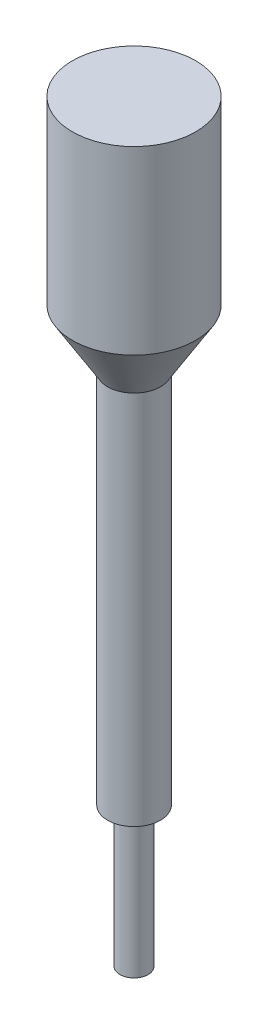
ISO-10303-21;
HEADER;
FILE_DESCRIPTION(('STEP AP214'),'2;1');
FILE_NAME('part.step','',(''),(''),'','','');
FILE_SCHEMA(('AUTOMOTIVE_DESIGN { 1 0 10303 214 1 1 1 1 }'));
ENDSEC;
DATA;
#1=APPLICATION_CONTEXT('core data for automotive mechanical design processes');
#2=APPLICATION_PROTOCOL_DEFINITION('international standard','automotive_design',2000,#1);
#3=PRODUCT_CONTEXT('',#1,'mechanical');
#4=PRODUCT('Part','Part','',(#3));
#5=PRODUCT_RELATED_PRODUCT_CATEGORY('part','',(#4));
#6=PRODUCT_DEFINITION_FORMATION('','',#4);
#7=PRODUCT_DEFINITION_CONTEXT('part definition',#1,'design');
#8=PRODUCT_DEFINITION('design','',#6,#7);
#9=PRODUCT_DEFINITION_SHAPE('','',#8);
#10=(LENGTH_UNIT() NAMED_UNIT(*) SI_UNIT(.MILLI.,.METRE.));
#11=(NAMED_UNIT(*) PLANE_ANGLE_UNIT() SI_UNIT($,.RADIAN.));
#12=(NAMED_UNIT(*) SI_UNIT($,.STERADIAN.) SOLID_ANGLE_UNIT());
#13=UNCERTAINTY_MEASURE_WITH_UNIT(LENGTH_MEASURE(1.E-05),#10,'distance_accuracy_value','');
#14=(GEOMETRIC_REPRESENTATION_CONTEXT(3) GLOBAL_UNCERTAINTY_ASSIGNED_CONTEXT((#13)) GLOBAL_UNIT_ASSIGNED_CONTEXT((#10,
#11,#12)) REPRESENTATION_CONTEXT('',''));
#15=CARTESIAN_POINT('',(0.,0.,0.));
#16=DIRECTION('',(0.,0.,1.));
#17=DIRECTION('',(1.,0.,0.));
#18=AXIS2_PLACEMENT_3D('',#15,#16,#17);
#19=CARTESIAN_POINT('',(0.,-186.420957082641,0.));
#20=DIRECTION('',(0.,-1.,0.));
#21=DIRECTION('',(0.,0.,-1.));
#22=AXIS2_PLACEMENT_3D('',#19,#20,#21);
#23=CYLINDRICAL_SURFACE('',#22,7.50000000000001);
#24=CARTESIAN_POINT('',(0.,-146.720957082641,0.));
#25=DIRECTION('',(0.,-1.,0.));
#26=DIRECTION('',(0.,0.,-1.));
#27=AXIS2_PLACEMENT_3D('',#24,#25,#26);
#28=CIRCLE('',#27,7.50000000000001);
#29=CARTESIAN_POINT('',(0.,-146.720957082641,-7.50000000000001));
#30=VERTEX_POINT('',#29);
#31=EDGE_CURVE('E56',#30,#30,#28,.T.);
#32=ORIENTED_EDGE('',*,*,#31,.F.);
#33=EDGE_LOOP('',(#32));
#34=FACE_BOUND('',#33,.T.);
#35=CARTESIAN_POINT('',(0.,-40.1209570826414,0.));
#36=DIRECTION('',(0.,-1.,0.));
#37=DIRECTION('',(0.,0.,-1.));
#38=AXIS2_PLACEMENT_3D('',#35,#36,#37);
#39=CIRCLE('',#38,7.50000000000002);
#40=CARTESIAN_POINT('',(0.,-40.1209570826414,-7.50000000000002));
#41=VERTEX_POINT('',#40);
#42=EDGE_CURVE('E10',#41,#41,#39,.T.);
#43=ORIENTED_EDGE('',*,*,#42,.T.);
#44=EDGE_LOOP('',(#43));
#45=FACE_BOUND('',#44,.T.);
#46=ADVANCED_FACE('F40',(#34,#45),#23,.T.);
#47=CARTESIAN_POINT('',(0.,-23.7209570826414,0.));
#48=DIRECTION('',(0.,1.,0.));
#49=DIRECTION('',(0.,0.,1.));
#50=AXIS2_PLACEMENT_3D('',#47,#48,#49);
#51=CONICAL_SURFACE('',#50,17.5,0.547562235939997);
#52=ORIENTED_EDGE('',*,*,#42,.F.);
#53=EDGE_LOOP('',(#52));
#54=FACE_BOUND('',#53,.T.);
#55=CARTESIAN_POINT('',(0.,-23.7209570826414,0.));
#56=DIRECTION('',(0.,-1.,0.));
#57=DIRECTION('',(0.,0.,-1.));
#58=AXIS2_PLACEMENT_3D('',#55,#56,#57);
#59=CIRCLE('',#58,17.5);
#60=CARTESIAN_POINT('',(0.,-23.7209570826414,-17.5));
#61=VERTEX_POINT('',#60);
#62=EDGE_CURVE('E43',#61,#61,#59,.T.);
#63=ORIENTED_EDGE('',*,*,#62,.T.);
#64=EDGE_LOOP('',(#63));
#65=FACE_BOUND('',#64,.T.);
#66=ADVANCED_FACE('F67',(#54,#65),#51,.T.);
#67=CARTESIAN_POINT('',(0.,-186.420957082641,0.));
#68=DIRECTION('',(0.,-1.,0.));
#69=DIRECTION('',(0.,0.,-1.));
#70=AXIS2_PLACEMENT_3D('',#67,#68,#69);
#71=CYLINDRICAL_SURFACE('',#70,17.5);
#72=ORIENTED_EDGE('',*,*,#62,.F.);
#73=EDGE_LOOP('',(#72));
#74=FACE_BOUND('',#73,.T.);
#75=CARTESIAN_POINT('',(0.,27.5790429173585,0.));
#76=DIRECTION('',(0.,-1.,0.));
#77=DIRECTION('',(0.,0.,-1.));
#78=AXIS2_PLACEMENT_3D('',#75,#76,#77);
#79=CIRCLE('',#78,17.5);
#80=CARTESIAN_POINT('',(0.,27.5790429173585,-17.5));
#81=VERTEX_POINT('',#80);
#82=EDGE_CURVE('E50',#81,#81,#79,.T.);
#83=ORIENTED_EDGE('',*,*,#82,.T.);
#84=EDGE_LOOP('',(#83));
#85=FACE_BOUND('',#84,.T.);
#86=ADVANCED_FACE('F68',(#74,#85),#71,.T.);
#87=CARTESIAN_POINT('',(0.,27.5790429173586,17.5));
#88=DIRECTION('',(0.,-1.,0.));
#89=DIRECTION('',(0.,0.,-1.));
#90=AXIS2_PLACEMENT_3D('',#87,#88,#89);
#91=PLANE('',#90);
#92=ORIENTED_EDGE('',*,*,#82,.F.);
#93=EDGE_LOOP('',(#92));
#94=FACE_BOUND('',#93,.T.);
#95=ADVANCED_FACE('F73',(#94),#91,.F.);
#96=CARTESIAN_POINT('',(0.,-186.420957082641,3.99999999999997));
#97=DIRECTION('',(0.,1.,0.));
#98=DIRECTION('',(0.,0.,1.));
#99=AXIS2_PLACEMENT_3D('',#96,#97,#98);
#100=PLANE('',#99);
#101=CARTESIAN_POINT('',(0.,-186.420957082641,0.));
#102=DIRECTION('',(0.,-1.,0.));
#103=DIRECTION('',(0.,0.,-1.));
#104=AXIS2_PLACEMENT_3D('',#101,#102,#103);
#105=CIRCLE('',#104,3.99999999999997);
#106=CARTESIAN_POINT('',(0.,-186.420957082641,-3.99999999999997));
#107=VERTEX_POINT('',#106);
#108=EDGE_CURVE('E51',#107,#107,#105,.T.);
#109=ORIENTED_EDGE('',*,*,#108,.T.);
#110=EDGE_LOOP('',(#109));
#111=FACE_BOUND('',#110,.T.);
#112=ADVANCED_FACE('F83',(#111),#100,.F.);
#113=CARTESIAN_POINT('',(0.,-186.420957082641,0.));
#114=DIRECTION('',(0.,-1.,0.));
#115=DIRECTION('',(0.,0.,-1.));
#116=AXIS2_PLACEMENT_3D('',#113,#114,#115);
#117=CYLINDRICAL_SURFACE('',#116,3.99999999999997);
#118=ORIENTED_EDGE('',*,*,#108,.F.);
#119=EDGE_LOOP('',(#118));
#120=FACE_BOUND('',#119,.T.);
#121=CARTESIAN_POINT('',(0.,-146.720957082641,0.));
#122=DIRECTION('',(0.,-1.,0.));
#123=DIRECTION('',(0.,0.,-1.));
#124=AXIS2_PLACEMENT_3D('',#121,#122,#123);
#125=CIRCLE('',#124,3.99999999999998);
#126=CARTESIAN_POINT('',(0.,-146.720957082641,-3.99999999999998));
#127=VERTEX_POINT('',#126);
#128=EDGE_CURVE('E57',#127,#127,#125,.T.);
#129=ORIENTED_EDGE('',*,*,#128,.T.);
#130=EDGE_LOOP('',(#129));
#131=FACE_BOUND('',#130,.T.);
#132=ADVANCED_FACE('F82',(#120,#131),#117,.T.);
#133=CARTESIAN_POINT('',(0.,-146.720957082641,7.50000000000001));
#134=DIRECTION('',(0.,1.,0.));
#135=DIRECTION('',(0.,0.,1.));
#136=AXIS2_PLACEMENT_3D('',#133,#134,#135);
#137=PLANE('',#136);
#138=ORIENTED_EDGE('',*,*,#128,.F.);
#139=EDGE_LOOP('',(#138));
#140=FACE_BOUND('',#139,.T.);
#141=ORIENTED_EDGE('',*,*,#31,.T.);
#142=EDGE_LOOP('',(#141));
#143=FACE_BOUND('',#142,.T.);
#144=ADVANCED_FACE('F65',(#140,#143),#137,.F.);
#145=CLOSED_SHELL('',(#46,#66,#86,#95,#112,#132,#144));
#146=MANIFOLD_SOLID_BREP('B2',#145);
#147=ADVANCED_BREP_SHAPE_REPRESENTATION('',(#18,#146),#14);
#148=SHAPE_DEFINITION_REPRESENTATION(#9,#147);
ENDSEC;
END-ISO-10303-21;
